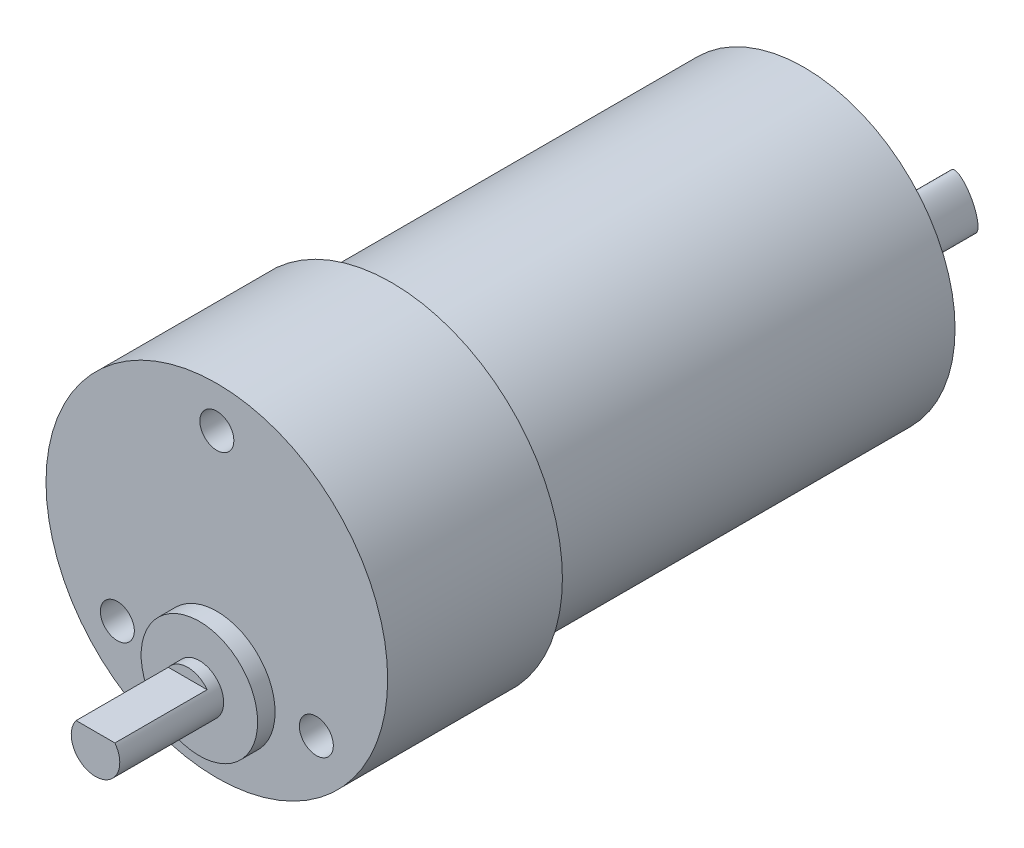
ISO-10303-21;
HEADER;
FILE_DESCRIPTION(('STEP AP214'),'2;1');
FILE_NAME('part.step','',(''),(''),'','','');
FILE_SCHEMA(('AUTOMOTIVE_DESIGN { 1 0 10303 214 1 1 1 1 }'));
ENDSEC;
DATA;
#1=APPLICATION_CONTEXT('core data for automotive mechanical design processes');
#2=APPLICATION_PROTOCOL_DEFINITION('international standard','automotive_design',2000,#1);
#3=PRODUCT_CONTEXT('',#1,'mechanical');
#4=PRODUCT('Part','Part','',(#3));
#5=PRODUCT_RELATED_PRODUCT_CATEGORY('part','',(#4));
#6=PRODUCT_DEFINITION_FORMATION('','',#4);
#7=PRODUCT_DEFINITION_CONTEXT('part definition',#1,'design');
#8=PRODUCT_DEFINITION('design','',#6,#7);
#9=PRODUCT_DEFINITION_SHAPE('','',#8);
#10=(LENGTH_UNIT() NAMED_UNIT(*) SI_UNIT(.MILLI.,.METRE.));
#11=(NAMED_UNIT(*) PLANE_ANGLE_UNIT() SI_UNIT($,.RADIAN.));
#12=(NAMED_UNIT(*) SI_UNIT($,.STERADIAN.) SOLID_ANGLE_UNIT());
#13=UNCERTAINTY_MEASURE_WITH_UNIT(LENGTH_MEASURE(1.E-05),#10,'distance_accuracy_value','');
#14=(GEOMETRIC_REPRESENTATION_CONTEXT(3) GLOBAL_UNCERTAINTY_ASSIGNED_CONTEXT((#13)) GLOBAL_UNIT_ASSIGNED_CONTEXT((#10,
#11,#12)) REPRESENTATION_CONTEXT('',''));
#15=CARTESIAN_POINT('',(0.,0.,0.));
#16=DIRECTION('',(0.,0.,1.));
#17=DIRECTION('',(1.,0.,0.));
#18=AXIS2_PLACEMENT_3D('',#15,#16,#17);
#19=CARTESIAN_POINT('',(0.,0.,-42.5));
#20=DIRECTION('',(0.,0.,1.));
#21=DIRECTION('',(1.,0.,0.));
#22=AXIS2_PLACEMENT_3D('',#19,#20,#21);
#23=PLANE('',#22);
#24=CARTESIAN_POINT('',(-9.44303506460174,-4.81550503776105,-42.5));
#25=DIRECTION('',(0.,0.,-1.));
#26=DIRECTION('',(0.454292928090665,-0.89085236458507,0.));
#27=AXIS2_PLACEMENT_3D('',#24,#25,#26);
#28=ELLIPSE('',#27,2.55300836874035,1.01196642810864);
#29=CARTESIAN_POINT('',(-8.28322141732671,-7.08985857985886,-42.5));
#30=VERTEX_POINT('',#29);
#31=EDGE_CURVE('E40',#30,#30,#28,.T.);
#32=ORIENTED_EDGE('',*,*,#31,.F.);
#33=EDGE_LOOP('',(#32));
#34=FACE_BOUND('',#33,.T.);
#35=CARTESIAN_POINT('',(0.,0.,-42.5));
#36=DIRECTION('',(0.,0.,1.));
#37=DIRECTION('',(1.,0.,0.));
#38=AXIS2_PLACEMENT_3D('',#35,#36,#37);
#39=CIRCLE('',#38,15.55);
#40=CARTESIAN_POINT('',(15.55,0.,-42.5));
#41=VERTEX_POINT('',#40);
#42=EDGE_CURVE('E87',#41,#41,#39,.T.);
#43=ORIENTED_EDGE('',*,*,#42,.F.);
#44=EDGE_LOOP('',(#43));
#45=FACE_BOUND('',#44,.T.);
#46=CARTESIAN_POINT('',(9.44630215990046,4.80909300220531,-42.5));
#47=DIRECTION('',(0.,0.,-1.));
#48=DIRECTION('',(0.453688019075971,-0.891160581122685,0.));
#49=AXIS2_PLACEMENT_3D('',#46,#47,#48);
#50=ELLIPSE('',#49,2.55300836874035,1.01196642810864);
#51=CARTESIAN_POINT('',(10.6045714693986,2.53395258070758,-42.5));
#52=VERTEX_POINT('',#51);
#53=EDGE_CURVE('E11',#52,#52,#50,.T.);
#54=ORIENTED_EDGE('',*,*,#53,.F.);
#55=EDGE_LOOP('',(#54));
#56=FACE_BOUND('',#55,.T.);
#57=ADVANCED_FACE('F32',(#34,#45,#56),#23,.F.);
#58=CARTESIAN_POINT('',(0.,-8.73,19.8));
#59=DIRECTION('',(0.,0.,1.));
#60=DIRECTION('',(1.,0.,0.));
#61=AXIS2_PLACEMENT_3D('',#58,#59,#60);
#62=PLANE('',#61);
#63=CARTESIAN_POINT('',(0.,-8.73,19.8));
#64=DIRECTION('',(0.,0.,1.));
#65=DIRECTION('',(1.,0.,0.));
#66=AXIS2_PLACEMENT_3D('',#63,#64,#65);
#67=CIRCLE('',#66,6.);
#68=CARTESIAN_POINT('',(6.,-8.73,19.8));
#69=VERTEX_POINT('',#68);
#70=EDGE_CURVE('E103',#69,#69,#67,.T.);
#71=ORIENTED_EDGE('',*,*,#70,.T.);
#72=EDGE_LOOP('',(#71));
#73=FACE_BOUND('',#72,.T.);
#74=CARTESIAN_POINT('',(0.,-8.73,19.8));
#75=DIRECTION('',(0.,0.,1.));
#76=DIRECTION('',(1.,0.,0.));
#77=AXIS2_PLACEMENT_3D('',#74,#75,#76);
#78=CIRCLE('',#77,2.5);
#79=CARTESIAN_POINT('',(2.5,-8.73,19.8));
#80=VERTEX_POINT('',#79);
#81=EDGE_CURVE('E65',#80,#80,#78,.T.);
#82=ORIENTED_EDGE('',*,*,#81,.F.);
#83=EDGE_LOOP('',(#82));
#84=FACE_BOUND('',#83,.T.);
#85=ADVANCED_FACE('F179',(#73,#84),#62,.T.);
#86=CARTESIAN_POINT('',(0.,0.,18.));
#87=DIRECTION('',(0.,0.,1.));
#88=DIRECTION('',(1.,0.,0.));
#89=AXIS2_PLACEMENT_3D('',#86,#87,#88);
#90=PLANE('',#89);
#91=CARTESIAN_POINT('',(0.,13.37,18.));
#92=DIRECTION('',(0.,0.,1.));
#93=DIRECTION('',(1.,0.,0.));
#94=AXIS2_PLACEMENT_3D('',#91,#92,#93);
#95=CIRCLE('',#94,1.75);
#96=CARTESIAN_POINT('',(1.75,13.37,18.));
#97=VERTEX_POINT('',#96);
#98=EDGE_CURVE('E64',#97,#97,#95,.T.);
#99=ORIENTED_EDGE('',*,*,#98,.F.);
#100=EDGE_LOOP('',(#99));
#101=FACE_BOUND('',#100,.T.);
#102=CARTESIAN_POINT('',(10.250000074,-8.73,18.));
#103=DIRECTION('',(0.,0.,1.));
#104=DIRECTION('',(1.,0.,0.));
#105=AXIS2_PLACEMENT_3D('',#102,#103,#104);
#106=CIRCLE('',#105,1.75);
#107=CARTESIAN_POINT('',(12.000000074,-8.73,18.));
#108=VERTEX_POINT('',#107);
#109=EDGE_CURVE('E118',#108,#108,#106,.T.);
#110=ORIENTED_EDGE('',*,*,#109,.F.);
#111=EDGE_LOOP('',(#110));
#112=FACE_BOUND('',#111,.T.);
#113=CARTESIAN_POINT('',(-10.25,-8.73,18.));
#114=DIRECTION('',(0.,0.,1.));
#115=DIRECTION('',(1.,0.,0.));
#116=AXIS2_PLACEMENT_3D('',#113,#114,#115);
#117=CIRCLE('',#116,1.75);
#118=CARTESIAN_POINT('',(-8.5,-8.73,18.));
#119=VERTEX_POINT('',#118);
#120=EDGE_CURVE('E112',#119,#119,#117,.T.);
#121=ORIENTED_EDGE('',*,*,#120,.F.);
#122=EDGE_LOOP('',(#121));
#123=FACE_BOUND('',#122,.T.);
#124=CARTESIAN_POINT('',(0.,0.,18.));
#125=DIRECTION('',(0.,0.,1.));
#126=DIRECTION('',(1.,0.,0.));
#127=AXIS2_PLACEMENT_3D('',#124,#125,#126);
#128=CIRCLE('',#127,17.6);
#129=CARTESIAN_POINT('',(17.6,0.,18.));
#130=VERTEX_POINT('',#129);
#131=EDGE_CURVE('E96',#130,#130,#128,.T.);
#132=ORIENTED_EDGE('',*,*,#131,.T.);
#133=EDGE_LOOP('',(#132));
#134=FACE_BOUND('',#133,.T.);
#135=CARTESIAN_POINT('',(0.,-8.73,18.));
#136=DIRECTION('',(0.,0.,1.));
#137=DIRECTION('',(1.,0.,0.));
#138=AXIS2_PLACEMENT_3D('',#135,#136,#137);
#139=CIRCLE('',#138,6.);
#140=CARTESIAN_POINT('',(6.,-8.73,18.));
#141=VERTEX_POINT('',#140);
#142=EDGE_CURVE('E106',#141,#141,#139,.T.);
#143=ORIENTED_EDGE('',*,*,#142,.F.);
#144=EDGE_LOOP('',(#143));
#145=FACE_BOUND('',#144,.T.);
#146=ADVANCED_FACE('F182',(#101,#112,#123,#134,#145),#90,.T.);
#147=CARTESIAN_POINT('',(0.,0.,-42.5));
#148=DIRECTION('',(0.,0.,1.));
#149=DIRECTION('',(1.,0.,0.));
#150=AXIS2_PLACEMENT_3D('',#147,#148,#149);
#151=CYLINDRICAL_SURFACE('',#150,15.55);
#152=ORIENTED_EDGE('',*,*,#42,.T.);
#153=EDGE_LOOP('',(#152));
#154=FACE_BOUND('',#153,.T.);
#155=CARTESIAN_POINT('',(0.,0.,0.));
#156=DIRECTION('',(0.,0.,1.));
#157=DIRECTION('',(1.,0.,0.));
#158=AXIS2_PLACEMENT_3D('',#155,#156,#157);
#159=CIRCLE('',#158,15.55);
#160=CARTESIAN_POINT('',(15.55,0.,0.));
#161=VERTEX_POINT('',#160);
#162=EDGE_CURVE('E91',#161,#161,#159,.T.);
#163=ORIENTED_EDGE('',*,*,#162,.F.);
#164=EDGE_LOOP('',(#163));
#165=FACE_BOUND('',#164,.T.);
#166=ADVANCED_FACE('F34',(#154,#165),#151,.T.);
#167=CARTESIAN_POINT('',(0.,0.,18.));
#168=DIRECTION('',(0.,0.,-1.));
#169=DIRECTION('',(-1.,0.,0.));
#170=AXIS2_PLACEMENT_3D('',#167,#168,#169);
#171=CYLINDRICAL_SURFACE('',#170,17.6);
#172=ORIENTED_EDGE('',*,*,#131,.F.);
#173=EDGE_LOOP('',(#172));
#174=FACE_BOUND('',#173,.T.);
#175=CARTESIAN_POINT('',(0.,0.,0.));
#176=DIRECTION('',(0.,0.,1.));
#177=DIRECTION('',(1.,0.,0.));
#178=AXIS2_PLACEMENT_3D('',#175,#176,#177);
#179=CIRCLE('',#178,17.6);
#180=CARTESIAN_POINT('',(17.6,0.,0.));
#181=VERTEX_POINT('',#180);
#182=EDGE_CURVE('E99',#181,#181,#179,.T.);
#183=ORIENTED_EDGE('',*,*,#182,.T.);
#184=EDGE_LOOP('',(#183));
#185=FACE_BOUND('',#184,.T.);
#186=ADVANCED_FACE('F193',(#174,#185),#171,.T.);
#187=CARTESIAN_POINT('',(0.,0.,0.));
#188=DIRECTION('',(0.,0.,1.));
#189=DIRECTION('',(1.,0.,0.));
#190=AXIS2_PLACEMENT_3D('',#187,#188,#189);
#191=PLANE('',#190);
#192=ORIENTED_EDGE('',*,*,#162,.T.);
#193=EDGE_LOOP('',(#192));
#194=FACE_BOUND('',#193,.T.);
#195=ORIENTED_EDGE('',*,*,#182,.F.);
#196=EDGE_LOOP('',(#195));
#197=FACE_BOUND('',#196,.T.);
#198=ADVANCED_FACE('F186',(#194,#197),#191,.F.);
#199=CARTESIAN_POINT('',(0.,-8.73,19.8));
#200=DIRECTION('',(0.,0.,-1.));
#201=DIRECTION('',(-1.,0.,0.));
#202=AXIS2_PLACEMENT_3D('',#199,#200,#201);
#203=CYLINDRICAL_SURFACE('',#202,6.);
#204=ORIENTED_EDGE('',*,*,#70,.F.);
#205=EDGE_LOOP('',(#204));
#206=FACE_BOUND('',#205,.T.);
#207=ORIENTED_EDGE('',*,*,#142,.T.);
#208=EDGE_LOOP('',(#207));
#209=FACE_BOUND('',#208,.T.);
#210=ADVANCED_FACE('F177',(#206,#209),#203,.T.);
#211=CARTESIAN_POINT('',(-10.25,-8.73,12.5));
#212=DIRECTION('',(0.,0.,1.));
#213=DIRECTION('',(1.,0.,0.));
#214=AXIS2_PLACEMENT_3D('',#211,#212,#213);
#215=CYLINDRICAL_SURFACE('',#214,1.75);
#216=CARTESIAN_POINT('',(-10.25,-8.73,12.5));
#217=DIRECTION('',(0.,0.,1.));
#218=DIRECTION('',(1.,0.,0.));
#219=AXIS2_PLACEMENT_3D('',#216,#217,#218);
#220=CIRCLE('',#219,1.75);
#221=CARTESIAN_POINT('',(-8.5,-8.73,12.5));
#222=VERTEX_POINT('',#221);
#223=EDGE_CURVE('E109',#222,#222,#220,.T.);
#224=ORIENTED_EDGE('',*,*,#223,.F.);
#225=EDGE_LOOP('',(#224));
#226=FACE_BOUND('',#225,.T.);
#227=ORIENTED_EDGE('',*,*,#120,.T.);
#228=EDGE_LOOP('',(#227));
#229=FACE_BOUND('',#228,.T.);
#230=ADVANCED_FACE('F173',(#226,#229),#215,.F.);
#231=CARTESIAN_POINT('',(-10.25,-8.73,12.5));
#232=DIRECTION('',(0.,0.,1.));
#233=DIRECTION('',(1.,0.,0.));
#234=AXIS2_PLACEMENT_3D('',#231,#232,#233);
#235=PLANE('',#234);
#236=ORIENTED_EDGE('',*,*,#223,.T.);
#237=EDGE_LOOP('',(#236));
#238=FACE_BOUND('',#237,.T.);
#239=ADVANCED_FACE('F169',(#238),#235,.T.);
#240=CARTESIAN_POINT('',(10.250000074,-8.73,12.5));
#241=DIRECTION('',(0.,0.,1.));
#242=DIRECTION('',(1.,0.,0.));
#243=AXIS2_PLACEMENT_3D('',#240,#241,#242);
#244=CYLINDRICAL_SURFACE('',#243,1.75);
#245=CARTESIAN_POINT('',(10.250000074,-8.73,12.5));
#246=DIRECTION('',(0.,0.,1.));
#247=DIRECTION('',(1.,0.,0.));
#248=AXIS2_PLACEMENT_3D('',#245,#246,#247);
#249=CIRCLE('',#248,1.75);
#250=CARTESIAN_POINT('',(12.000000074,-8.73,12.5));
#251=VERTEX_POINT('',#250);
#252=EDGE_CURVE('E115',#251,#251,#249,.T.);
#253=ORIENTED_EDGE('',*,*,#252,.F.);
#254=EDGE_LOOP('',(#253));
#255=FACE_BOUND('',#254,.T.);
#256=ORIENTED_EDGE('',*,*,#109,.T.);
#257=EDGE_LOOP('',(#256));
#258=FACE_BOUND('',#257,.T.);
#259=ADVANCED_FACE('F165',(#255,#258),#244,.F.);
#260=CARTESIAN_POINT('',(10.250000074,-8.73,12.5));
#261=DIRECTION('',(0.,0.,1.));
#262=DIRECTION('',(1.,0.,0.));
#263=AXIS2_PLACEMENT_3D('',#260,#261,#262);
#264=PLANE('',#263);
#265=ORIENTED_EDGE('',*,*,#252,.T.);
#266=EDGE_LOOP('',(#265));
#267=FACE_BOUND('',#266,.T.);
#268=ADVANCED_FACE('F161',(#267),#264,.T.);
#269=CARTESIAN_POINT('',(0.,13.37,12.5));
#270=DIRECTION('',(0.,0.,1.));
#271=DIRECTION('',(1.,0.,0.));
#272=AXIS2_PLACEMENT_3D('',#269,#270,#271);
#273=CYLINDRICAL_SURFACE('',#272,1.75);
#274=CARTESIAN_POINT('',(0.,13.37,12.5));
#275=DIRECTION('',(0.,0.,1.));
#276=DIRECTION('',(1.,0.,0.));
#277=AXIS2_PLACEMENT_3D('',#274,#275,#276);
#278=CIRCLE('',#277,1.75);
#279=CARTESIAN_POINT('',(1.75,13.37,12.5));
#280=VERTEX_POINT('',#279);
#281=EDGE_CURVE('E121',#280,#280,#278,.T.);
#282=ORIENTED_EDGE('',*,*,#281,.F.);
#283=EDGE_LOOP('',(#282));
#284=FACE_BOUND('',#283,.T.);
#285=ORIENTED_EDGE('',*,*,#98,.T.);
#286=EDGE_LOOP('',(#285));
#287=FACE_BOUND('',#286,.T.);
#288=ADVANCED_FACE('F157',(#284,#287),#273,.F.);
#289=CARTESIAN_POINT('',(0.,13.37,12.5));
#290=DIRECTION('',(0.,0.,1.));
#291=DIRECTION('',(1.,0.,0.));
#292=AXIS2_PLACEMENT_3D('',#289,#290,#291);
#293=PLANE('',#292);
#294=ORIENTED_EDGE('',*,*,#281,.T.);
#295=EDGE_LOOP('',(#294));
#296=FACE_BOUND('',#295,.T.);
#297=ADVANCED_FACE('F154',(#296),#293,.T.);
#298=CARTESIAN_POINT('',(0.,-8.73,21.));
#299=DIRECTION('',(0.,0.,-1.));
#300=DIRECTION('',(-1.,0.,0.));
#301=AXIS2_PLACEMENT_3D('',#298,#299,#300);
#302=CYLINDRICAL_SURFACE('',#301,2.5);
#303=CARTESIAN_POINT('',(0.,-8.73,21.));
#304=DIRECTION('',(0.,0.,1.));
#305=DIRECTION('',(1.,0.,0.));
#306=AXIS2_PLACEMENT_3D('',#303,#304,#305);
#307=CIRCLE('',#306,2.5);
#308=CARTESIAN_POINT('',(2.,-7.23,21.));
#309=VERTEX_POINT('',#308);
#310=CARTESIAN_POINT('',(-2.,-7.23,21.));
#311=VERTEX_POINT('',#310);
#312=EDGE_CURVE('E58',#309,#311,#307,.T.);
#313=ORIENTED_EDGE('',*,*,#312,.F.);
#314=DIRECTION('',(0.,0.,-1.));
#315=VECTOR('',#314,1.);
#316=CARTESIAN_POINT('',(2.,-7.23,30.5));
#317=LINE('',#316,#315);
#318=CARTESIAN_POINT('',(2.,-7.23,30.5));
#319=VERTEX_POINT('',#318);
#320=EDGE_CURVE('E71',#319,#309,#317,.T.);
#321=ORIENTED_EDGE('',*,*,#320,.F.);
#322=CARTESIAN_POINT('',(0.,-8.73,30.5));
#323=DIRECTION('',(0.,0.,1.));
#324=DIRECTION('',(1.,0.,0.));
#325=AXIS2_PLACEMENT_3D('',#322,#323,#324);
#326=CIRCLE('',#325,2.5);
#327=CARTESIAN_POINT('',(-2.,-7.23,30.5));
#328=VERTEX_POINT('',#327);
#329=EDGE_CURVE('E72',#328,#319,#326,.T.);
#330=ORIENTED_EDGE('',*,*,#329,.F.);
#331=DIRECTION('',(0.,0.,-1.));
#332=VECTOR('',#331,1.);
#333=CARTESIAN_POINT('',(-2.,-7.23,30.5));
#334=LINE('',#333,#332);
#335=EDGE_CURVE('E69',#328,#311,#334,.T.);
#336=ORIENTED_EDGE('',*,*,#335,.T.);
#337=EDGE_LOOP('',(#313,#321,#330,#336));
#338=FACE_BOUND('',#337,.T.);
#339=ORIENTED_EDGE('',*,*,#81,.T.);
#340=EDGE_LOOP('',(#339));
#341=FACE_BOUND('',#340,.T.);
#342=ADVANCED_FACE('F75',(#338,#341),#302,.T.);
#343=CARTESIAN_POINT('',(0.,-8.73,21.));
#344=DIRECTION('',(0.,0.,1.));
#345=DIRECTION('',(1.,0.,0.));
#346=AXIS2_PLACEMENT_3D('',#343,#344,#345);
#347=PLANE('',#346);
#348=DIRECTION('',(-1.,0.,0.));
#349=VECTOR('',#348,1.);
#350=CARTESIAN_POINT('',(2.,-7.23,21.));
#351=LINE('',#350,#349);
#352=EDGE_CURVE('E46',#309,#311,#351,.T.);
#353=ORIENTED_EDGE('',*,*,#352,.F.);
#354=ORIENTED_EDGE('',*,*,#312,.T.);
#355=EDGE_LOOP('',(#353,#354));
#356=FACE_BOUND('',#355,.T.);
#357=ADVANCED_FACE('F59',(#356),#347,.T.);
#358=CARTESIAN_POINT('',(2.,-7.23,30.5));
#359=DIRECTION('',(0.,-1.,0.));
#360=DIRECTION('',(0.,0.,-1.));
#361=AXIS2_PLACEMENT_3D('',#358,#359,#360);
#362=PLANE('',#361);
#363=ORIENTED_EDGE('',*,*,#352,.T.);
#364=ORIENTED_EDGE('',*,*,#335,.F.);
#365=DIRECTION('',(-1.,0.,0.));
#366=VECTOR('',#365,1.);
#367=CARTESIAN_POINT('',(2.,-7.23,30.5));
#368=LINE('',#367,#366);
#369=EDGE_CURVE('E54',#319,#328,#368,.T.);
#370=ORIENTED_EDGE('',*,*,#369,.F.);
#371=ORIENTED_EDGE('',*,*,#320,.T.);
#372=EDGE_LOOP('',(#363,#364,#370,#371));
#373=FACE_BOUND('',#372,.T.);
#374=ADVANCED_FACE('F68',(#373),#362,.F.);
#375=CARTESIAN_POINT('',(0.,-8.73,30.5));
#376=DIRECTION('',(0.,0.,1.));
#377=DIRECTION('',(1.,0.,0.));
#378=AXIS2_PLACEMENT_3D('',#375,#376,#377);
#379=PLANE('',#378);
#380=ORIENTED_EDGE('',*,*,#329,.T.);
#381=ORIENTED_EDGE('',*,*,#369,.T.);
#382=EDGE_LOOP('',(#380,#381));
#383=FACE_BOUND('',#382,.T.);
#384=ADVANCED_FACE('F143',(#383),#379,.T.);
#385=CARTESIAN_POINT('',(-9.44303506460174,-4.81550503776105,-49.5));
#386=DIRECTION('',(0.,0.,-1.));
#387=DIRECTION('',(0.454292928090665,-0.89085236458507,0.));
#388=AXIS2_PLACEMENT_3D('',#385,#386,#387);
#389=ELLIPSE('',#388,2.55300836874035,1.01196642810864);
#390=DIRECTION('',(0.,0.,1.));
#391=VECTOR('',#390,1.);
#392=SURFACE_OF_LINEAR_EXTRUSION('',#389,#391);
#393=CARTESIAN_POINT('',(-8.28322141732671,-7.08985857985886,-49.5));
#394=VERTEX_POINT('',#393);
#395=EDGE_CURVE('E73',#394,#394,#389,.T.);
#396=ORIENTED_EDGE('',*,*,#395,.F.);
#397=EDGE_LOOP('',(#396));
#398=FACE_BOUND('',#397,.T.);
#399=ORIENTED_EDGE('',*,*,#31,.T.);
#400=EDGE_LOOP('',(#399));
#401=FACE_BOUND('',#400,.T.);
#402=ADVANCED_FACE('F138',(#398,#401),#392,.F.);
#403=CARTESIAN_POINT('',(-9.44303506460174,-4.81550503776105,-49.5));
#404=DIRECTION('',(0.,0.,-1.));
#405=DIRECTION('',(-1.,0.,0.));
#406=AXIS2_PLACEMENT_3D('',#403,#404,#405);
#407=PLANE('',#406);
#408=ORIENTED_EDGE('',*,*,#395,.T.);
#409=EDGE_LOOP('',(#408));
#410=FACE_BOUND('',#409,.T.);
#411=ADVANCED_FACE('F142',(#410),#407,.T.);
#412=CARTESIAN_POINT('',(9.44630215990046,4.80909300220531,-49.5));
#413=DIRECTION('',(0.,0.,-1.));
#414=DIRECTION('',(0.453688019075971,-0.891160581122685,0.));
#415=AXIS2_PLACEMENT_3D('',#412,#413,#414);
#416=ELLIPSE('',#415,2.55300836874035,1.01196642810864);
#417=DIRECTION('',(0.,0.,1.));
#418=VECTOR('',#417,1.);
#419=SURFACE_OF_LINEAR_EXTRUSION('',#416,#418);
#420=CARTESIAN_POINT('',(10.6045714693986,2.53395258070758,-49.5));
#421=VERTEX_POINT('',#420);
#422=EDGE_CURVE('E135',#421,#421,#416,.T.);
#423=ORIENTED_EDGE('',*,*,#422,.F.);
#424=EDGE_LOOP('',(#423));
#425=FACE_BOUND('',#424,.T.);
#426=ORIENTED_EDGE('',*,*,#53,.T.);
#427=EDGE_LOOP('',(#426));
#428=FACE_BOUND('',#427,.T.);
#429=ADVANCED_FACE('F205',(#425,#428),#419,.F.);
#430=CARTESIAN_POINT('',(9.44630215990046,4.80909300220531,-49.5));
#431=DIRECTION('',(0.,0.,1.));
#432=DIRECTION('',(1.,0.,0.));
#433=AXIS2_PLACEMENT_3D('',#430,#431,#432);
#434=PLANE('',#433);
#435=ORIENTED_EDGE('',*,*,#422,.T.);
#436=EDGE_LOOP('',(#435));
#437=FACE_BOUND('',#436,.T.);
#438=ADVANCED_FACE('F207',(#437),#434,.F.);
#439=CLOSED_SHELL('',(#57,#85,#146,#166,#186,#198,#210,#230,#239,#259,#268,#288,#297,#342,#357,
#374,#384,#402,#411,#429,#438));
#440=MANIFOLD_SOLID_BREP('B2',#439);
#441=ADVANCED_BREP_SHAPE_REPRESENTATION('',(#18,#440),#14);
#442=SHAPE_DEFINITION_REPRESENTATION(#9,#441);
ENDSEC;
END-ISO-10303-21;
